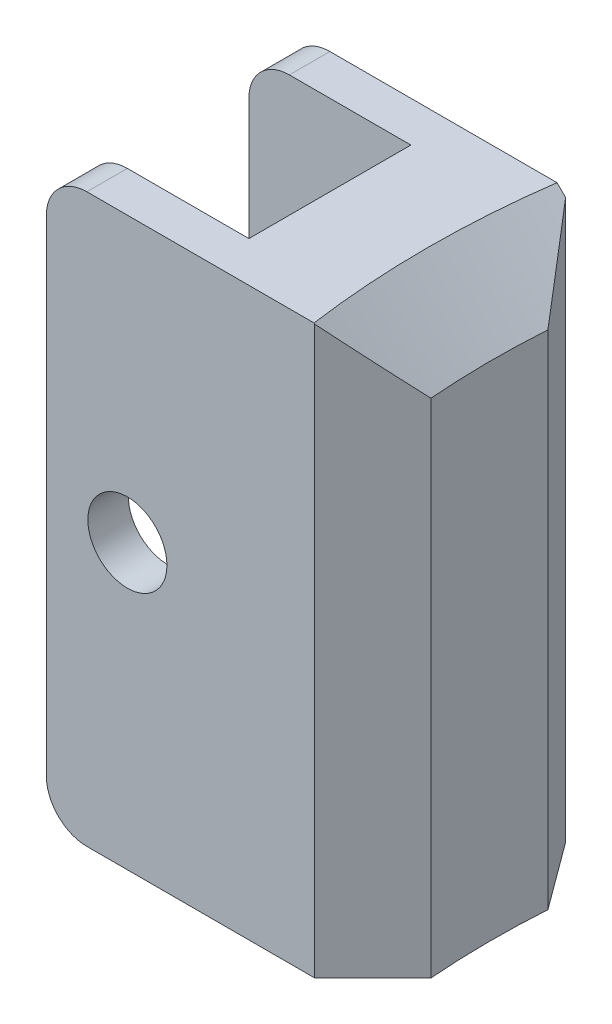
ISO-10303-21;
HEADER;
FILE_DESCRIPTION(('STEP AP214'),'2;1');
FILE_NAME('part.step','',(''),(''),'','','');
FILE_SCHEMA(('AUTOMOTIVE_DESIGN { 1 0 10303 214 1 1 1 1 }'));
ENDSEC;
DATA;
#1=APPLICATION_CONTEXT('core data for automotive mechanical design processes');
#2=APPLICATION_PROTOCOL_DEFINITION('international standard','automotive_design',2000,#1);
#3=PRODUCT_CONTEXT('',#1,'mechanical');
#4=PRODUCT('Part','Part','',(#3));
#5=PRODUCT_RELATED_PRODUCT_CATEGORY('part','',(#4));
#6=PRODUCT_DEFINITION_FORMATION('','',#4);
#7=PRODUCT_DEFINITION_CONTEXT('part definition',#1,'design');
#8=PRODUCT_DEFINITION('design','',#6,#7);
#9=PRODUCT_DEFINITION_SHAPE('','',#8);
#10=(LENGTH_UNIT() NAMED_UNIT(*) SI_UNIT(.MILLI.,.METRE.));
#11=(NAMED_UNIT(*) PLANE_ANGLE_UNIT() SI_UNIT($,.RADIAN.));
#12=(NAMED_UNIT(*) SI_UNIT($,.STERADIAN.) SOLID_ANGLE_UNIT());
#13=UNCERTAINTY_MEASURE_WITH_UNIT(LENGTH_MEASURE(1.E-05),#10,'distance_accuracy_value','');
#14=(GEOMETRIC_REPRESENTATION_CONTEXT(3) GLOBAL_UNCERTAINTY_ASSIGNED_CONTEXT((#13)) GLOBAL_UNIT_ASSIGNED_CONTEXT((#10,
#11,#12)) REPRESENTATION_CONTEXT('',''));
#15=CARTESIAN_POINT('',(0.,0.,0.));
#16=DIRECTION('',(0.,0.,1.));
#17=DIRECTION('',(1.,0.,0.));
#18=AXIS2_PLACEMENT_3D('',#15,#16,#17);
#19=CARTESIAN_POINT('',(-44.45,11.1125,4.7625));
#20=DIRECTION('',(1.,0.,0.));
#21=DIRECTION('',(0.,0.,-1.));
#22=AXIS2_PLACEMENT_3D('',#19,#20,#21);
#23=PLANE('',#22);
#24=DIRECTION('',(0.,-1.,0.));
#25=VECTOR('',#24,1.);
#26=CARTESIAN_POINT('',(-44.45,-11.1125,3.175));
#27=LINE('',#26,#25);
#28=CARTESIAN_POINT('',(-44.45,9.525,3.175));
#29=VERTEX_POINT('',#28);
#30=CARTESIAN_POINT('',(-44.45,-9.525,3.175));
#31=VERTEX_POINT('',#30);
#32=EDGE_CURVE('E154',#29,#31,#27,.T.);
#33=ORIENTED_EDGE('',*,*,#32,.T.);
#34=DIRECTION('',(0.,0.,-1.));
#35=VECTOR('',#34,1.);
#36=CARTESIAN_POINT('',(-44.45,-9.525,4.7625));
#37=LINE('',#36,#35);
#38=CARTESIAN_POINT('',(-44.45,-9.525,4.7625));
#39=VERTEX_POINT('',#38);
#40=EDGE_CURVE('E54',#31,#39,#37,.F.);
#41=ORIENTED_EDGE('',*,*,#40,.T.);
#42=DIRECTION('',(0.,-1.,0.));
#43=VECTOR('',#42,1.);
#44=CARTESIAN_POINT('',(-44.45,11.1125,4.7625));
#45=LINE('',#44,#43);
#46=CARTESIAN_POINT('',(-44.45,9.525,4.7625));
#47=VERTEX_POINT('',#46);
#48=EDGE_CURVE('E179',#47,#39,#45,.T.);
#49=ORIENTED_EDGE('',*,*,#48,.F.);
#50=DIRECTION('',(0.,0.,-1.));
#51=VECTOR('',#50,1.);
#52=CARTESIAN_POINT('',(-44.45,9.525,4.7625));
#53=LINE('',#52,#51);
#54=EDGE_CURVE('E247',#47,#29,#53,.T.);
#55=ORIENTED_EDGE('',*,*,#54,.T.);
#56=EDGE_LOOP('',(#33,#41,#49,#55));
#57=FACE_BOUND('',#56,.T.);
#58=ADVANCED_FACE('F32',(#57),#23,.F.);
#59=CARTESIAN_POINT('',(-28.575,11.1125,4.7625));
#60=DIRECTION('',(0.,-1.,0.));
#61=DIRECTION('',(1.,0.,0.));
#62=AXIS2_PLACEMENT_3D('',#59,#60,#61);
#63=PLANE('',#62);
#64=DIRECTION('',(-1.,0.,0.));
#65=VECTOR('',#64,1.);
#66=CARTESIAN_POINT('',(-28.575,11.1125,-4.7625));
#67=LINE('',#66,#65);
#68=CARTESIAN_POINT('',(-33.9576603103041,11.1125,-4.7625));
#69=VERTEX_POINT('',#68);
#70=CARTESIAN_POINT('',(-42.8625,11.1125,-4.7625));
#71=VERTEX_POINT('',#70);
#72=EDGE_CURVE('E172',#69,#71,#67,.T.);
#73=ORIENTED_EDGE('',*,*,#72,.T.);
#74=DIRECTION('',(0.,0.,-1.));
#75=VECTOR('',#74,1.);
#76=CARTESIAN_POINT('',(-42.8625,11.1125,4.7625));
#77=LINE('',#76,#75);
#78=CARTESIAN_POINT('',(-42.8625,11.1125,-3.175));
#79=VERTEX_POINT('',#78);
#80=EDGE_CURVE('E11',#71,#79,#77,.F.);
#81=ORIENTED_EDGE('',*,*,#80,.T.);
#82=DIRECTION('',(-1.,0.,0.));
#83=VECTOR('',#82,1.);
#84=CARTESIAN_POINT('',(-38.1,11.1125,-3.175));
#85=LINE('',#84,#83);
#86=CARTESIAN_POINT('',(-38.1,11.1125,-3.175));
#87=VERTEX_POINT('',#86);
#88=EDGE_CURVE('E163',#87,#79,#85,.T.);
#89=ORIENTED_EDGE('',*,*,#88,.F.);
#90=DIRECTION('',(0.,0.,1.));
#91=VECTOR('',#90,1.);
#92=CARTESIAN_POINT('',(-38.1,11.1125,-3.175));
#93=LINE('',#92,#91);
#94=CARTESIAN_POINT('',(-38.1,11.1125,3.175));
#95=VERTEX_POINT('',#94);
#96=EDGE_CURVE('E162',#87,#95,#93,.T.);
#97=ORIENTED_EDGE('',*,*,#96,.T.);
#98=DIRECTION('',(-1.,0.,0.));
#99=VECTOR('',#98,1.);
#100=CARTESIAN_POINT('',(-38.1,11.1125,3.175));
#101=LINE('',#100,#99);
#102=CARTESIAN_POINT('',(-42.8625,11.1125,3.175));
#103=VERTEX_POINT('',#102);
#104=EDGE_CURVE('E341',#95,#103,#101,.T.);
#105=ORIENTED_EDGE('',*,*,#104,.T.);
#106=DIRECTION('',(0.,0.,-1.));
#107=VECTOR('',#106,1.);
#108=CARTESIAN_POINT('',(-42.8625,11.1125,4.7625));
#109=LINE('',#108,#107);
#110=CARTESIAN_POINT('',(-42.8625,11.1125,4.7625));
#111=VERTEX_POINT('',#110);
#112=EDGE_CURVE('E40',#103,#111,#109,.F.);
#113=ORIENTED_EDGE('',*,*,#112,.T.);
#114=DIRECTION('',(-1.,0.,0.));
#115=VECTOR('',#114,1.);
#116=CARTESIAN_POINT('',(-28.575,11.1125,4.7625));
#117=LINE('',#116,#115);
#118=CARTESIAN_POINT('',(-33.9576603103041,11.1125,4.7625));
#119=VERTEX_POINT('',#118);
#120=EDGE_CURVE('E177',#119,#111,#117,.T.);
#121=ORIENTED_EDGE('',*,*,#120,.F.);
#122=CARTESIAN_POINT('',(0.,11.1125,0.));
#123=DIRECTION('',(0.,-1.,0.));
#124=DIRECTION('',(1.,0.,0.));
#125=AXIS2_PLACEMENT_3D('',#122,#123,#124);
#126=CIRCLE('',#125,34.29);
#127=EDGE_CURVE('E225',#119,#69,#126,.T.);
#128=ORIENTED_EDGE('',*,*,#127,.T.);
#129=EDGE_LOOP('',(#73,#81,#89,#97,#105,#113,#121,#128));
#130=FACE_BOUND('',#129,.T.);
#131=ADVANCED_FACE('F216',(#130),#63,.F.);
#132=DIRECTION('',(0.,-1.,0.));
#133=VECTOR('',#132,1.);
#134=CARTESIAN_POINT('',(-44.45,11.1125,-4.7625));
#135=LINE('',#134,#133);
#136=CARTESIAN_POINT('',(-44.45,9.525,-4.7625));
#137=VERTEX_POINT('',#136);
#138=CARTESIAN_POINT('',(-44.45,-9.525,-4.7625));
#139=VERTEX_POINT('',#138);
#140=EDGE_CURVE('E187',#137,#139,#135,.T.);
#141=ORIENTED_EDGE('',*,*,#140,.T.);
#142=DIRECTION('',(0.,0.,-1.));
#143=VECTOR('',#142,1.);
#144=CARTESIAN_POINT('',(-44.45,-9.525,4.7625));
#145=LINE('',#144,#143);
#146=CARTESIAN_POINT('',(-44.45,-9.525,-3.175));
#147=VERTEX_POINT('',#146);
#148=EDGE_CURVE('E237',#139,#147,#145,.F.);
#149=ORIENTED_EDGE('',*,*,#148,.T.);
#150=DIRECTION('',(0.,-1.,0.));
#151=VECTOR('',#150,1.);
#152=CARTESIAN_POINT('',(-44.45,-11.1125,-3.175));
#153=LINE('',#152,#151);
#154=CARTESIAN_POINT('',(-44.45,9.525,-3.175));
#155=VERTEX_POINT('',#154);
#156=EDGE_CURVE('E170',#155,#147,#153,.T.);
#157=ORIENTED_EDGE('',*,*,#156,.F.);
#158=DIRECTION('',(0.,0.,-1.));
#159=VECTOR('',#158,1.);
#160=CARTESIAN_POINT('',(-44.45,9.525,4.7625));
#161=LINE('',#160,#159);
#162=EDGE_CURVE('E235',#155,#137,#161,.T.);
#163=ORIENTED_EDGE('',*,*,#162,.T.);
#164=EDGE_LOOP('',(#141,#149,#157,#163));
#165=FACE_BOUND('',#164,.T.);
#166=ADVANCED_FACE('F214',(#165),#23,.F.);
#167=CARTESIAN_POINT('',(-44.45,-11.1125,4.7625));
#168=DIRECTION('',(0.,1.,0.));
#169=DIRECTION('',(-1.,0.,0.));
#170=AXIS2_PLACEMENT_3D('',#167,#168,#169);
#171=PLANE('',#170);
#172=DIRECTION('',(1.,0.,0.));
#173=VECTOR('',#172,1.);
#174=CARTESIAN_POINT('',(-38.1,-11.1125,-3.175));
#175=LINE('',#174,#173);
#176=CARTESIAN_POINT('',(-42.8625,-11.1125,-3.175));
#177=VERTEX_POINT('',#176);
#178=CARTESIAN_POINT('',(-38.1,-11.1125,-3.175));
#179=VERTEX_POINT('',#178);
#180=EDGE_CURVE('E141',#177,#179,#175,.T.);
#181=ORIENTED_EDGE('',*,*,#180,.F.);
#182=DIRECTION('',(0.,0.,-1.));
#183=VECTOR('',#182,1.);
#184=CARTESIAN_POINT('',(-42.8625,-11.1125,4.7625));
#185=LINE('',#184,#183);
#186=CARTESIAN_POINT('',(-42.8625,-11.1125,-4.7625));
#187=VERTEX_POINT('',#186);
#188=EDGE_CURVE('E266',#177,#187,#185,.T.);
#189=ORIENTED_EDGE('',*,*,#188,.T.);
#190=DIRECTION('',(1.,0.,0.));
#191=VECTOR('',#190,1.);
#192=CARTESIAN_POINT('',(-44.45,-11.1125,-4.7625));
#193=LINE('',#192,#191);
#194=CARTESIAN_POINT('',(-33.6214216836475,-11.1125,-4.7625));
#195=VERTEX_POINT('',#194);
#196=EDGE_CURVE('E180',#187,#195,#193,.T.);
#197=ORIENTED_EDGE('',*,*,#196,.T.);
#198=DIRECTION('',(0.593040555527492,0.,0.805172589883463));
#199=VECTOR('',#198,1.);
#200=CARTESIAN_POINT('',(-33.6214216836475,-11.1125,-4.7625));
#201=LINE('',#200,#199);
#202=CARTESIAN_POINT('',(-31.678807444753,-11.1125,-2.12500797134109));
#203=VERTEX_POINT('',#202);
#204=EDGE_CURVE('E284',#195,#203,#201,.T.);
#205=ORIENTED_EDGE('',*,*,#204,.T.);
#206=CARTESIAN_POINT('',(0.,-11.1125,0.));
#207=DIRECTION('',(0.,1.,0.));
#208=DIRECTION('',(-1.,0.,0.));
#209=AXIS2_PLACEMENT_3D('',#206,#207,#208);
#210=CIRCLE('',#209,31.75);
#211=CARTESIAN_POINT('',(-31.6526522796179,-11.1125,2.48437188552765));
#212=VERTEX_POINT('',#211);
#213=EDGE_CURVE('E346',#203,#212,#210,.T.);
#214=ORIENTED_EDGE('',*,*,#213,.T.);
#215=DIRECTION('',(-0.707106781186548,0.,0.707106781186548));
#216=VECTOR('',#215,1.);
#217=CARTESIAN_POINT('',(-31.6526522796179,-11.1125,2.48437188552765));
#218=LINE('',#217,#216);
#219=CARTESIAN_POINT('',(-33.9307803940902,-11.1125,4.7625));
#220=VERTEX_POINT('',#219);
#221=EDGE_CURVE('E263',#212,#220,#218,.T.);
#222=ORIENTED_EDGE('',*,*,#221,.T.);
#223=DIRECTION('',(1.,0.,0.));
#224=VECTOR('',#223,1.);
#225=CARTESIAN_POINT('',(-44.45,-11.1125,4.7625));
#226=LINE('',#225,#224);
#227=CARTESIAN_POINT('',(-42.8625,-11.1125,4.7625));
#228=VERTEX_POINT('',#227);
#229=EDGE_CURVE('E182',#228,#220,#226,.T.);
#230=ORIENTED_EDGE('',*,*,#229,.F.);
#231=DIRECTION('',(0.,0.,-1.));
#232=VECTOR('',#231,1.);
#233=CARTESIAN_POINT('',(-42.8625,-11.1125,4.7625));
#234=LINE('',#233,#232);
#235=CARTESIAN_POINT('',(-42.8625,-11.1125,3.175));
#236=VERTEX_POINT('',#235);
#237=EDGE_CURVE('E260',#228,#236,#234,.T.);
#238=ORIENTED_EDGE('',*,*,#237,.T.);
#239=DIRECTION('',(1.,0.,0.));
#240=VECTOR('',#239,1.);
#241=CARTESIAN_POINT('',(-38.1,-11.1125,3.175));
#242=LINE('',#241,#240);
#243=CARTESIAN_POINT('',(-38.1,-11.1125,3.175));
#244=VERTEX_POINT('',#243);
#245=EDGE_CURVE('E168',#236,#244,#242,.T.);
#246=ORIENTED_EDGE('',*,*,#245,.T.);
#247=DIRECTION('',(0.,0.,1.));
#248=VECTOR('',#247,1.);
#249=CARTESIAN_POINT('',(-38.1,-11.1125,-3.175));
#250=LINE('',#249,#248);
#251=EDGE_CURVE('E160',#179,#244,#250,.T.);
#252=ORIENTED_EDGE('',*,*,#251,.F.);
#253=EDGE_LOOP('',(#181,#189,#197,#205,#214,#222,#230,#238,#246,#252));
#254=FACE_BOUND('',#253,.T.);
#255=ADVANCED_FACE('F165',(#254),#171,.F.);
#256=CARTESIAN_POINT('',(0.,0.,4.7625));
#257=DIRECTION('',(0.,0.,1.));
#258=DIRECTION('',(1.,0.,0.));
#259=AXIS2_PLACEMENT_3D('',#256,#257,#258);
#260=PLANE('',#259);
#261=CARTESIAN_POINT('',(-41.275,0.,4.7625));
#262=DIRECTION('',(0.,0.,1.));
#263=DIRECTION('',(1.,0.,0.));
#264=AXIS2_PLACEMENT_3D('',#261,#262,#263);
#265=CIRCLE('',#264,1.55);
#266=CARTESIAN_POINT('',(-39.725,0.,4.7625));
#267=VERTEX_POINT('',#266);
#268=EDGE_CURVE('E352',#267,#267,#265,.T.);
#269=ORIENTED_EDGE('',*,*,#268,.F.);
#270=EDGE_LOOP('',(#269));
#271=FACE_BOUND('',#270,.T.);
#272=ORIENTED_EDGE('',*,*,#48,.T.);
#273=CARTESIAN_POINT('',(-42.8625,-9.525,4.7625));
#274=DIRECTION('',(0.,0.,1.));
#275=DIRECTION('',(1.,0.,0.));
#276=AXIS2_PLACEMENT_3D('',#273,#274,#275);
#277=CIRCLE('',#276,1.5875);
#278=EDGE_CURVE('E253',#39,#228,#277,.T.);
#279=ORIENTED_EDGE('',*,*,#278,.T.);
#280=ORIENTED_EDGE('',*,*,#229,.T.);
#281=DIRECTION('',(0.,1.,0.));
#282=VECTOR('',#281,1.);
#283=CARTESIAN_POINT('',(-33.9307803940902,11.1125,4.7625));
#284=LINE('',#283,#282);
#285=CARTESIAN_POINT('',(-33.9307803940902,11.0858808081161,4.7625));
#286=VERTEX_POINT('',#285);
#287=EDGE_CURVE('E269',#220,#286,#284,.T.);
#288=ORIENTED_EDGE('',*,*,#287,.T.);
#289=CARTESIAN_POINT('',(-33.9307803940902,11.0858808081161,4.7625));
#290=CARTESIAN_POINT('',(-33.9352603970809,11.0903173229757,4.7625));
#291=CARTESIAN_POINT('',(-33.939740391594,11.0947538463958,4.7625));
#292=CARTESIAN_POINT('',(-33.9487003636653,11.1036269103571,4.7625));
#293=CARTESIAN_POINT('',(-33.9531803412234,11.1080634508983,4.7625));
#294=CARTESIAN_POINT('',(-33.9576603103041,11.1125,4.7625));
#295=B_SPLINE_CURVE_WITH_KNOTS('',3,(#289,#290,#291,#292,#293,#294),.UNSPECIFIED.,.F.,.F.,(4,2,
4),(0.,0.0189150156768313,0.0378300313536604),.UNSPECIFIED.);
#296=EDGE_CURVE('E300',#286,#119,#295,.T.);
#297=ORIENTED_EDGE('',*,*,#296,.T.);
#298=ORIENTED_EDGE('',*,*,#120,.T.);
#299=CARTESIAN_POINT('',(-42.8625,9.525,4.7625));
#300=DIRECTION('',(0.,0.,1.));
#301=DIRECTION('',(1.,0.,0.));
#302=AXIS2_PLACEMENT_3D('',#299,#300,#301);
#303=CIRCLE('',#302,1.5875);
#304=EDGE_CURVE('E251',#111,#47,#303,.T.);
#305=ORIENTED_EDGE('',*,*,#304,.T.);
#306=EDGE_LOOP('',(#272,#279,#280,#288,#297,#298,#305));
#307=FACE_BOUND('',#306,.T.);
#308=ADVANCED_FACE('F208',(#271,#307),#260,.T.);
#309=CARTESIAN_POINT('',(0.,0.,-4.7625));
#310=DIRECTION('',(0.,0.,1.));
#311=DIRECTION('',(1.,0.,0.));
#312=AXIS2_PLACEMENT_3D('',#309,#310,#311);
#313=PLANE('',#312);
#314=CARTESIAN_POINT('',(-41.275,0.,-4.7625));
#315=DIRECTION('',(0.,0.,1.));
#316=DIRECTION('',(1.,0.,0.));
#317=AXIS2_PLACEMENT_3D('',#314,#315,#316);
#318=CIRCLE('',#317,1.55);
#319=CARTESIAN_POINT('',(-39.725,0.,-4.7625));
#320=VERTEX_POINT('',#319);
#321=EDGE_CURVE('E355',#320,#320,#318,.T.);
#322=ORIENTED_EDGE('',*,*,#321,.T.);
#323=EDGE_LOOP('',(#322));
#324=FACE_BOUND('',#323,.T.);
#325=ORIENTED_EDGE('',*,*,#196,.F.);
#326=CARTESIAN_POINT('',(-42.8625,-9.525,-4.7625));
#327=DIRECTION('',(0.,0.,1.));
#328=DIRECTION('',(1.,0.,0.));
#329=AXIS2_PLACEMENT_3D('',#326,#327,#328);
#330=CIRCLE('',#329,1.5875);
#331=EDGE_CURVE('E276',#187,#139,#330,.F.);
#332=ORIENTED_EDGE('',*,*,#331,.T.);
#333=ORIENTED_EDGE('',*,*,#140,.F.);
#334=CARTESIAN_POINT('',(-42.8625,9.525,-4.7625));
#335=DIRECTION('',(0.,0.,1.));
#336=DIRECTION('',(1.,0.,0.));
#337=AXIS2_PLACEMENT_3D('',#334,#335,#336);
#338=CIRCLE('',#337,1.5875);
#339=EDGE_CURVE('E232',#137,#71,#338,.F.);
#340=ORIENTED_EDGE('',*,*,#339,.T.);
#341=ORIENTED_EDGE('',*,*,#72,.F.);
#342=CARTESIAN_POINT('',(-33.9576603103041,11.1125,-4.7625));
#343=CARTESIAN_POINT('',(-33.9016232281389,11.0570060045181,-4.7625));
#344=CARTESIAN_POINT('',(-33.8455848015017,11.0015133667974,-4.7625));
#345=CARTESIAN_POINT('',(-33.7335052592828,10.8905308068781,-4.7625));
#346=CARTESIAN_POINT('',(-33.6774641437012,10.8350408846794,-4.7625));
#347=CARTESIAN_POINT('',(-33.6214216836475,10.7795523202419,-4.7625));
#348=B_SPLINE_CURVE_WITH_KNOTS('',3,(#342,#343,#344,#345,#346,#347),.UNSPECIFIED.,.F.,.F.,(4,2,
4),(0.,0.236595948635203,0.473191897271758),.UNSPECIFIED.);
#349=CARTESIAN_POINT('',(-33.6214216836475,10.7795523202419,-4.7625));
#350=VERTEX_POINT('',#349);
#351=EDGE_CURVE('E184',#69,#350,#348,.T.);
#352=ORIENTED_EDGE('',*,*,#351,.T.);
#353=DIRECTION('',(0.,-1.,0.));
#354=VECTOR('',#353,1.);
#355=CARTESIAN_POINT('',(-33.6214216836475,0.,-4.7625));
#356=LINE('',#355,#354);
#357=EDGE_CURVE('E197',#350,#195,#356,.T.);
#358=ORIENTED_EDGE('',*,*,#357,.T.);
#359=EDGE_LOOP('',(#325,#332,#333,#340,#341,#352,#358));
#360=FACE_BOUND('',#359,.T.);
#361=ADVANCED_FACE('F203',(#324,#360),#313,.F.);
#362=CARTESIAN_POINT('',(-38.1,11.1125,-3.175));
#363=DIRECTION('',(1.,0.,0.));
#364=DIRECTION('',(0.,0.,-1.));
#365=AXIS2_PLACEMENT_3D('',#362,#363,#364);
#366=PLANE('',#365);
#367=DIRECTION('',(0.,1.,0.));
#368=VECTOR('',#367,1.);
#369=CARTESIAN_POINT('',(-38.1,11.1125,3.175));
#370=LINE('',#369,#368);
#371=EDGE_CURVE('E342',#244,#95,#370,.T.);
#372=ORIENTED_EDGE('',*,*,#371,.T.);
#373=ORIENTED_EDGE('',*,*,#96,.F.);
#374=DIRECTION('',(0.,1.,0.));
#375=VECTOR('',#374,1.);
#376=CARTESIAN_POINT('',(-38.1,11.1125,-3.175));
#377=LINE('',#376,#375);
#378=EDGE_CURVE('E146',#179,#87,#377,.T.);
#379=ORIENTED_EDGE('',*,*,#378,.F.);
#380=ORIENTED_EDGE('',*,*,#251,.T.);
#381=EDGE_LOOP('',(#372,#373,#379,#380));
#382=FACE_BOUND('',#381,.T.);
#383=ADVANCED_FACE('F159',(#382),#366,.F.);
#384=CARTESIAN_POINT('',(0.,0.,-3.175));
#385=DIRECTION('',(0.,0.,-1.));
#386=DIRECTION('',(-1.,0.,0.));
#387=AXIS2_PLACEMENT_3D('',#384,#385,#386);
#388=PLANE('',#387);
#389=CARTESIAN_POINT('',(-41.275,0.,-3.175));
#390=DIRECTION('',(0.,0.,-1.));
#391=DIRECTION('',(-1.,0.,0.));
#392=AXIS2_PLACEMENT_3D('',#389,#390,#391);
#393=CIRCLE('',#392,1.55);
#394=CARTESIAN_POINT('',(-39.725,0.,-3.175));
#395=VERTEX_POINT('',#394);
#396=EDGE_CURVE('E311',#395,#395,#393,.T.);
#397=ORIENTED_EDGE('',*,*,#396,.T.);
#398=EDGE_LOOP('',(#397));
#399=FACE_BOUND('',#398,.T.);
#400=ORIENTED_EDGE('',*,*,#156,.T.);
#401=CARTESIAN_POINT('',(-42.8625,-9.525,-3.175));
#402=DIRECTION('',(0.,0.,-1.));
#403=DIRECTION('',(-1.,0.,0.));
#404=AXIS2_PLACEMENT_3D('',#401,#402,#403);
#405=CIRCLE('',#404,1.5875);
#406=EDGE_CURVE('E149',#147,#177,#405,.F.);
#407=ORIENTED_EDGE('',*,*,#406,.T.);
#408=ORIENTED_EDGE('',*,*,#180,.T.);
#409=ORIENTED_EDGE('',*,*,#378,.T.);
#410=ORIENTED_EDGE('',*,*,#88,.T.);
#411=CARTESIAN_POINT('',(-42.8625,9.525,-3.175));
#412=DIRECTION('',(0.,0.,-1.));
#413=DIRECTION('',(-1.,0.,0.));
#414=AXIS2_PLACEMENT_3D('',#411,#412,#413);
#415=CIRCLE('',#414,1.5875);
#416=EDGE_CURVE('E234',#79,#155,#415,.F.);
#417=ORIENTED_EDGE('',*,*,#416,.T.);
#418=EDGE_LOOP('',(#400,#407,#408,#409,#410,#417));
#419=FACE_BOUND('',#418,.T.);
#420=ADVANCED_FACE('F144',(#399,#419),#388,.F.);
#421=CARTESIAN_POINT('',(0.,0.,3.175));
#422=DIRECTION('',(0.,0.,-1.));
#423=DIRECTION('',(-1.,0.,0.));
#424=AXIS2_PLACEMENT_3D('',#421,#422,#423);
#425=PLANE('',#424);
#426=CARTESIAN_POINT('',(-41.275,0.,3.175));
#427=DIRECTION('',(0.,0.,-1.));
#428=DIRECTION('',(-1.,0.,0.));
#429=AXIS2_PLACEMENT_3D('',#426,#427,#428);
#430=CIRCLE('',#429,1.55);
#431=CARTESIAN_POINT('',(-39.725,0.,3.175));
#432=VERTEX_POINT('',#431);
#433=EDGE_CURVE('E272',#432,#432,#430,.T.);
#434=ORIENTED_EDGE('',*,*,#433,.F.);
#435=EDGE_LOOP('',(#434));
#436=FACE_BOUND('',#435,.T.);
#437=ORIENTED_EDGE('',*,*,#245,.F.);
#438=CARTESIAN_POINT('',(-42.8625,-9.525,3.175));
#439=DIRECTION('',(0.,0.,-1.));
#440=DIRECTION('',(-1.,0.,0.));
#441=AXIS2_PLACEMENT_3D('',#438,#439,#440);
#442=CIRCLE('',#441,1.5875);
#443=EDGE_CURVE('E245',#236,#31,#442,.T.);
#444=ORIENTED_EDGE('',*,*,#443,.T.);
#445=ORIENTED_EDGE('',*,*,#32,.F.);
#446=CARTESIAN_POINT('',(-42.8625,9.525,3.175));
#447=DIRECTION('',(0.,0.,-1.));
#448=DIRECTION('',(-1.,0.,0.));
#449=AXIS2_PLACEMENT_3D('',#446,#447,#448);
#450=CIRCLE('',#449,1.5875);
#451=EDGE_CURVE('E239',#29,#103,#450,.T.);
#452=ORIENTED_EDGE('',*,*,#451,.T.);
#453=ORIENTED_EDGE('',*,*,#104,.F.);
#454=ORIENTED_EDGE('',*,*,#371,.F.);
#455=EDGE_LOOP('',(#437,#444,#445,#452,#453,#454));
#456=FACE_BOUND('',#455,.T.);
#457=ADVANCED_FACE('F340',(#436,#456),#425,.T.);
#458=CARTESIAN_POINT('',(0.,-11.1125,0.));
#459=DIRECTION('',(0.,1.,0.));
#460=DIRECTION('',(-1.,0.,0.));
#461=AXIS2_PLACEMENT_3D('',#458,#459,#460);
#462=CYLINDRICAL_SURFACE('',#461,31.75);
#463=ORIENTED_EDGE('',*,*,#213,.F.);
#464=DIRECTION('',(0.,1.,0.));
#465=VECTOR('',#464,1.);
#466=CARTESIAN_POINT('',(-31.678807444753,-11.1125,-2.12500797134109));
#467=LINE('',#466,#465);
#468=CARTESIAN_POINT('',(-31.678807444753,8.57250000000001,-2.12500797134109));
#469=VERTEX_POINT('',#468);
#470=EDGE_CURVE('E291',#203,#469,#467,.T.);
#471=ORIENTED_EDGE('',*,*,#470,.T.);
#472=CARTESIAN_POINT('',(0.,8.57250000000001,0.));
#473=DIRECTION('',(0.,-1.,0.));
#474=DIRECTION('',(1.,0.,0.));
#475=AXIS2_PLACEMENT_3D('',#472,#473,#474);
#476=CIRCLE('',#475,31.75);
#477=CARTESIAN_POINT('',(-31.6526522796179,8.57250000000001,2.48437188552765));
#478=VERTEX_POINT('',#477);
#479=EDGE_CURVE('E292',#469,#478,#476,.F.);
#480=ORIENTED_EDGE('',*,*,#479,.T.);
#481=DIRECTION('',(0.,1.,0.));
#482=VECTOR('',#481,1.);
#483=CARTESIAN_POINT('',(-31.6526522796179,-11.1125,2.48437188552765));
#484=LINE('',#483,#482);
#485=EDGE_CURVE('E297',#478,#212,#484,.F.);
#486=ORIENTED_EDGE('',*,*,#485,.T.);
#487=EDGE_LOOP('',(#463,#471,#480,#486));
#488=FACE_BOUND('',#487,.T.);
#489=ADVANCED_FACE('F323',(#488),#462,.F.);
#490=CARTESIAN_POINT('',(-31.6526522796179,-11.1125,2.48437188552765));
#491=DIRECTION('',(0.707106781186548,0.,0.707106781186548));
#492=DIRECTION('',(0.,1.,0.));
#493=AXIS2_PLACEMENT_3D('',#490,#491,#492);
#494=PLANE('',#493);
#495=ORIENTED_EDGE('',*,*,#221,.F.);
#496=ORIENTED_EDGE('',*,*,#485,.F.);
#497=CARTESIAN_POINT('',(-33.9307803940902,11.0858808081161,4.7625));
#498=CARTESIAN_POINT('',(-33.7426197611455,10.8733954006392,4.5743393670553));
#499=CARTESIAN_POINT('',(-33.5540731150106,10.6615924600558,4.38579272092035));
#500=CARTESIAN_POINT('',(-33.1761618915087,10.2394706932847,4.00788149741842));
#501=CARTESIAN_POINT('',(-32.9867973432342,10.0291518149989,3.81851694914397));
#502=CARTESIAN_POINT('',(-32.6071903935126,9.61010151907732,3.43890999942233));
#503=CARTESIAN_POINT('',(-32.4169479886119,9.40137010769528,3.24866759452163));
#504=CARTESIAN_POINT('',(-32.0355203604371,8.98561782557998,2.86723996634688));
#505=CARTESIAN_POINT('',(-31.844335104129,8.77859701546964,2.67605471003877));
#506=CARTESIAN_POINT('',(-31.6526522796179,8.57249999999998,2.48437188552768));
#507=B_SPLINE_CURVE_WITH_KNOTS('',3,(#497,#498,#499,#500,#501,#502,#503,#504,#505,#506),
.UNSPECIFIED.,.F.,.F.,(4,2,2,2,4),(0.,1.02158207285164,2.04312810275649,3.06467815488652,
4.08626425633454),.UNSPECIFIED.);
#508=EDGE_CURVE('E310',#286,#478,#507,.T.);
#509=ORIENTED_EDGE('',*,*,#508,.F.);
#510=ORIENTED_EDGE('',*,*,#287,.F.);
#511=EDGE_LOOP('',(#495,#496,#509,#510));
#512=FACE_BOUND('',#511,.T.);
#513=ADVANCED_FACE('F319',(#512),#494,.T.);
#514=CARTESIAN_POINT('',(0.,8.57250000000001,0.));
#515=DIRECTION('',(0.,1.,0.));
#516=DIRECTION('',(-1.,0.,0.));
#517=AXIS2_PLACEMENT_3D('',#514,#515,#516);
#518=CONICAL_SURFACE('',#517,31.75,0.785398163397451);
#519=ORIENTED_EDGE('',*,*,#508,.T.);
#520=ORIENTED_EDGE('',*,*,#479,.F.);
#521=CARTESIAN_POINT('',(-31.678807444753,8.57250000000001,-2.12500797134109));
#522=CARTESIAN_POINT('',(-31.8428186118604,8.75105107540496,-2.34768632775171));
#523=CARTESIAN_POINT('',(-32.0062611981724,8.93108265096127,-2.56959272064761));
#524=CARTESIAN_POINT('',(-32.3320537541385,9.29388388717091,-3.01192205817263));
#525=CARTESIAN_POINT('',(-32.4944038183681,9.47665330628302,-3.23234513120722));
#526=CARTESIAN_POINT('',(-32.8180831801691,9.84473706510092,-3.6718053799272));
#527=CARTESIAN_POINT('',(-32.9794124868414,10.03005138207,-3.89084256796889));
#528=CARTESIAN_POINT('',(-33.3011202682093,10.4030631877581,-4.32762599718857));
#529=CARTESIAN_POINT('',(-33.4614986582718,10.5907608840663,-4.54537212346004));
#530=CARTESIAN_POINT('',(-33.6214216836475,10.7795523202419,-4.7625));
#531=B_SPLINE_CURVE_WITH_KNOTS('',3,(#521,#522,#523,#524,#525,#526,#527,#528,#529,#530),
.UNSPECIFIED.,.F.,.F.,(4,2,2,2,4),(0.,0.987560572830621,1.97503452715913,2.96249966490268,
3.9500514076395),.UNSPECIFIED.);
#532=EDGE_CURVE('E306',#350,#469,#531,.F.);
#533=ORIENTED_EDGE('',*,*,#532,.F.);
#534=ORIENTED_EDGE('',*,*,#351,.F.);
#535=ORIENTED_EDGE('',*,*,#127,.F.);
#536=ORIENTED_EDGE('',*,*,#296,.F.);
#537=EDGE_LOOP('',(#519,#520,#533,#534,#535,#536));
#538=FACE_BOUND('',#537,.T.);
#539=ADVANCED_FACE('F199',(#538),#518,.F.);
#540=CARTESIAN_POINT('',(-33.6214216836475,-11.1125,-4.7625));
#541=DIRECTION('',(0.805172589883463,0.,-0.593040555527492));
#542=DIRECTION('',(0.,1.,0.));
#543=AXIS2_PLACEMENT_3D('',#540,#541,#542);
#544=PLANE('',#543);
#545=ORIENTED_EDGE('',*,*,#532,.T.);
#546=ORIENTED_EDGE('',*,*,#470,.F.);
#547=ORIENTED_EDGE('',*,*,#204,.F.);
#548=ORIENTED_EDGE('',*,*,#357,.F.);
#549=EDGE_LOOP('',(#545,#546,#547,#548));
#550=FACE_BOUND('',#549,.T.);
#551=ADVANCED_FACE('F290',(#550),#544,.T.);
#552=CARTESIAN_POINT('',(-41.275,0.,-4.7625));
#553=DIRECTION('',(0.,0.,1.));
#554=DIRECTION('',(1.,0.,0.));
#555=AXIS2_PLACEMENT_3D('',#552,#553,#554);
#556=CYLINDRICAL_SURFACE('',#555,1.55);
#557=CARTESIAN_POINT('',(-39.725,0.,3.175));
#558=CARTESIAN_POINT('',(-39.725,0.,3.19153645833334));
#559=CARTESIAN_POINT('',(-39.725,0.,3.20807291666667));
#560=CARTESIAN_POINT('',(-39.725,0.,3.24114583333334));
#561=CARTESIAN_POINT('',(-39.725,0.,3.25768229166667));
#562=CARTESIAN_POINT('',(-39.725,0.,3.29075520833333));
#563=CARTESIAN_POINT('',(-39.725,0.,3.30729166666667));
#564=CARTESIAN_POINT('',(-39.725,0.,3.34036458333333));
#565=CARTESIAN_POINT('',(-39.725,0.,3.35690104166667));
#566=CARTESIAN_POINT('',(-39.725,0.,3.38997395833333));
#567=CARTESIAN_POINT('',(-39.725,0.,3.40651041666667));
#568=CARTESIAN_POINT('',(-39.725,0.,3.43958333333333));
#569=CARTESIAN_POINT('',(-39.725,0.,3.45611979166667));
#570=CARTESIAN_POINT('',(-39.725,0.,3.48919270833333));
#571=CARTESIAN_POINT('',(-39.725,0.,3.50572916666667));
#572=CARTESIAN_POINT('',(-39.725,0.,3.53880208333333));
#573=CARTESIAN_POINT('',(-39.725,0.,3.55533854166667));
#574=CARTESIAN_POINT('',(-39.725,0.,3.58841145833334));
#575=CARTESIAN_POINT('',(-39.725,0.,3.60494791666667));
#576=CARTESIAN_POINT('',(-39.725,0.,3.63802083333333));
#577=CARTESIAN_POINT('',(-39.725,0.,3.65455729166667));
#578=CARTESIAN_POINT('',(-39.725,0.,3.68763020833333));
#579=CARTESIAN_POINT('',(-39.725,0.,3.70416666666667));
#580=CARTESIAN_POINT('',(-39.725,0.,3.73723958333334));
#581=CARTESIAN_POINT('',(-39.725,0.,3.75377604166667));
#582=CARTESIAN_POINT('',(-39.725,0.,3.78684895833333));
#583=CARTESIAN_POINT('',(-39.725,0.,3.80338541666667));
#584=CARTESIAN_POINT('',(-39.725,0.,3.83645833333333));
#585=CARTESIAN_POINT('',(-39.725,0.,3.85299479166667));
#586=CARTESIAN_POINT('',(-39.725,0.,3.88606770833333));
#587=CARTESIAN_POINT('',(-39.725,0.,3.90260416666667));
#588=CARTESIAN_POINT('',(-39.725,0.,3.93567708333333));
#589=CARTESIAN_POINT('',(-39.725,0.,3.95221354166667));
#590=CARTESIAN_POINT('',(-39.725,0.,3.98528645833333));
#591=CARTESIAN_POINT('',(-39.725,0.,4.00182291666667));
#592=CARTESIAN_POINT('',(-39.725,0.,4.03489583333333));
#593=CARTESIAN_POINT('',(-39.725,0.,4.05143229166667));
#594=CARTESIAN_POINT('',(-39.725,0.,4.08450520833333));
#595=CARTESIAN_POINT('',(-39.725,0.,4.10104166666667));
#596=CARTESIAN_POINT('',(-39.725,0.,4.13411458333333));
#597=CARTESIAN_POINT('',(-39.725,0.,4.15065104166667));
#598=CARTESIAN_POINT('',(-39.725,0.,4.18372395833333));
#599=CARTESIAN_POINT('',(-39.725,0.,4.20026041666667));
#600=CARTESIAN_POINT('',(-39.725,0.,4.23333333333333));
#601=CARTESIAN_POINT('',(-39.725,0.,4.24986979166667));
#602=CARTESIAN_POINT('',(-39.725,0.,4.28294270833333));
#603=CARTESIAN_POINT('',(-39.725,0.,4.29947916666667));
#604=CARTESIAN_POINT('',(-39.725,0.,4.33255208333333));
#605=CARTESIAN_POINT('',(-39.725,0.,4.34908854166667));
#606=CARTESIAN_POINT('',(-39.725,0.,4.38216145833333));
#607=CARTESIAN_POINT('',(-39.725,0.,4.39869791666667));
#608=CARTESIAN_POINT('',(-39.725,0.,4.43177083333333));
#609=CARTESIAN_POINT('',(-39.725,0.,4.44830729166667));
#610=CARTESIAN_POINT('',(-39.725,0.,4.48138020833333));
#611=CARTESIAN_POINT('',(-39.725,0.,4.49791666666667));
#612=CARTESIAN_POINT('',(-39.725,0.,4.53098958333333));
#613=CARTESIAN_POINT('',(-39.725,0.,4.54752604166667));
#614=CARTESIAN_POINT('',(-39.725,0.,4.58059895833333));
#615=CARTESIAN_POINT('',(-39.725,0.,4.59713541666667));
#616=CARTESIAN_POINT('',(-39.725,0.,4.63020833333333));
#617=CARTESIAN_POINT('',(-39.725,0.,4.64674479166667));
#618=CARTESIAN_POINT('',(-39.725,0.,4.67981770833333));
#619=CARTESIAN_POINT('',(-39.725,0.,4.69635416666667));
#620=CARTESIAN_POINT('',(-39.725,0.,4.72942708333333));
#621=CARTESIAN_POINT('',(-39.725,0.,4.74596354166667));
#622=CARTESIAN_POINT('',(-39.725,0.,4.7625));
#623=B_SPLINE_CURVE_WITH_KNOTS('',3,(#557,#558,#559,#560,#561,#562,#563,#564,#565,#566,#567,
#568,#569,#570,#571,#572,#573,#574,#575,#576,#577,#578,#579,#580,#581,#582,#583,#584,#585,#586,
#587,#588,#589,#590,#591,#592,#593,#594,#595,#596,#597,#598,#599,#600,#601,#602,#603,#604,#605,
#606,#607,#608,#609,#610,#611,#612,#613,#614,#615,#616,#617,#618,#619,#620,#621,#622),
.UNSPECIFIED.,.F.,.F.,(4,2,2,2,2,2,2,2,2,2,2,2,2,2,2,2,2,2,2,2,2,2,2,2,2,2,2,2,2,2,2,2,4),(0.,
0.0496093750000006,0.0992187499999995,0.148828125,0.198437499999999,0.248046875,0.29765625,
0.347265624999999,0.396875,0.446484375,0.496093749999999,0.545703125,0.5953125,
0.644921874999999,0.69453125,0.744140624999999,0.793749999999999,0.843359375,0.892968749999999,
0.942578124999999,0.992187499999998,1.041796875,1.09140625,1.141015625,1.190625,1.240234375,
1.28984375,1.339453125,1.3890625,1.438671875,1.48828125,1.537890625,1.5875),.UNSPECIFIED.);
#624=EDGE_CURVE('BSEAM318',#432,#267,#623,.T.);
#625=ORIENTED_EDGE('',*,*,#433,.T.);
#626=ORIENTED_EDGE('',*,*,#268,.T.);
#627=ORIENTED_EDGE('',*,*,#624,.T.);
#628=ORIENTED_EDGE('',*,*,#624,.F.);
#629=EDGE_LOOP('',(#625,#627,#626,#628));
#630=FACE_BOUND('',#629,.T.);
#631=ADVANCED_FACE('F318',(#630),#556,.F.);
#632=CARTESIAN_POINT('',(-39.725,0.,-4.7625));
#633=CARTESIAN_POINT('',(-39.725,0.,-4.74596354166667));
#634=CARTESIAN_POINT('',(-39.725,0.,-4.72942708333333));
#635=CARTESIAN_POINT('',(-39.725,0.,-4.69635416666667));
#636=CARTESIAN_POINT('',(-39.725,0.,-4.67981770833333));
#637=CARTESIAN_POINT('',(-39.725,0.,-4.64674479166667));
#638=CARTESIAN_POINT('',(-39.725,0.,-4.63020833333333));
#639=CARTESIAN_POINT('',(-39.725,0.,-4.59713541666667));
#640=CARTESIAN_POINT('',(-39.725,0.,-4.58059895833333));
#641=CARTESIAN_POINT('',(-39.725,0.,-4.54752604166667));
#642=CARTESIAN_POINT('',(-39.725,0.,-4.53098958333333));
#643=CARTESIAN_POINT('',(-39.725,0.,-4.49791666666667));
#644=CARTESIAN_POINT('',(-39.725,0.,-4.48138020833333));
#645=CARTESIAN_POINT('',(-39.725,0.,-4.44830729166667));
#646=CARTESIAN_POINT('',(-39.725,0.,-4.43177083333333));
#647=CARTESIAN_POINT('',(-39.725,0.,-4.39869791666667));
#648=CARTESIAN_POINT('',(-39.725,0.,-4.38216145833333));
#649=CARTESIAN_POINT('',(-39.725,0.,-4.34908854166667));
#650=CARTESIAN_POINT('',(-39.725,0.,-4.33255208333333));
#651=CARTESIAN_POINT('',(-39.725,0.,-4.29947916666667));
#652=CARTESIAN_POINT('',(-39.725,0.,-4.28294270833333));
#653=CARTESIAN_POINT('',(-39.725,0.,-4.24986979166667));
#654=CARTESIAN_POINT('',(-39.725,0.,-4.23333333333333));
#655=CARTESIAN_POINT('',(-39.725,0.,-4.20026041666667));
#656=CARTESIAN_POINT('',(-39.725,0.,-4.18372395833333));
#657=CARTESIAN_POINT('',(-39.725,0.,-4.15065104166667));
#658=CARTESIAN_POINT('',(-39.725,0.,-4.13411458333333));
#659=CARTESIAN_POINT('',(-39.725,0.,-4.10104166666667));
#660=CARTESIAN_POINT('',(-39.725,0.,-4.08450520833333));
#661=CARTESIAN_POINT('',(-39.725,0.,-4.05143229166667));
#662=CARTESIAN_POINT('',(-39.725,0.,-4.03489583333333));
#663=CARTESIAN_POINT('',(-39.725,0.,-4.00182291666667));
#664=CARTESIAN_POINT('',(-39.725,0.,-3.98528645833333));
#665=CARTESIAN_POINT('',(-39.725,0.,-3.95221354166667));
#666=CARTESIAN_POINT('',(-39.725,0.,-3.93567708333333));
#667=CARTESIAN_POINT('',(-39.725,0.,-3.90260416666667));
#668=CARTESIAN_POINT('',(-39.725,0.,-3.88606770833333));
#669=CARTESIAN_POINT('',(-39.725,0.,-3.85299479166667));
#670=CARTESIAN_POINT('',(-39.725,0.,-3.83645833333333));
#671=CARTESIAN_POINT('',(-39.725,0.,-3.80338541666667));
#672=CARTESIAN_POINT('',(-39.725,0.,-3.78684895833333));
#673=CARTESIAN_POINT('',(-39.725,0.,-3.75377604166667));
#674=CARTESIAN_POINT('',(-39.725,0.,-3.73723958333333));
#675=CARTESIAN_POINT('',(-39.725,0.,-3.70416666666667));
#676=CARTESIAN_POINT('',(-39.725,0.,-3.68763020833333));
#677=CARTESIAN_POINT('',(-39.725,0.,-3.65455729166667));
#678=CARTESIAN_POINT('',(-39.725,0.,-3.63802083333333));
#679=CARTESIAN_POINT('',(-39.725,0.,-3.60494791666667));
#680=CARTESIAN_POINT('',(-39.725,0.,-3.58841145833333));
#681=CARTESIAN_POINT('',(-39.725,0.,-3.55533854166667));
#682=CARTESIAN_POINT('',(-39.725,0.,-3.53880208333333));
#683=CARTESIAN_POINT('',(-39.725,0.,-3.50572916666667));
#684=CARTESIAN_POINT('',(-39.725,0.,-3.48919270833333));
#685=CARTESIAN_POINT('',(-39.725,0.,-3.45611979166667));
#686=CARTESIAN_POINT('',(-39.725,0.,-3.43958333333333));
#687=CARTESIAN_POINT('',(-39.725,0.,-3.40651041666667));
#688=CARTESIAN_POINT('',(-39.725,0.,-3.38997395833333));
#689=CARTESIAN_POINT('',(-39.725,0.,-3.35690104166667));
#690=CARTESIAN_POINT('',(-39.725,0.,-3.34036458333333));
#691=CARTESIAN_POINT('',(-39.725,0.,-3.30729166666667));
#692=CARTESIAN_POINT('',(-39.725,0.,-3.29075520833333));
#693=CARTESIAN_POINT('',(-39.725,0.,-3.25768229166667));
#694=CARTESIAN_POINT('',(-39.725,0.,-3.24114583333333));
#695=CARTESIAN_POINT('',(-39.725,0.,-3.20807291666667));
#696=CARTESIAN_POINT('',(-39.725,0.,-3.19153645833333));
#697=CARTESIAN_POINT('',(-39.725,0.,-3.175));
#698=B_SPLINE_CURVE_WITH_KNOTS('',3,(#632,#633,#634,#635,#636,#637,#638,#639,#640,#641,#642,
#643,#644,#645,#646,#647,#648,#649,#650,#651,#652,#653,#654,#655,#656,#657,#658,#659,#660,#661,
#662,#663,#664,#665,#666,#667,#668,#669,#670,#671,#672,#673,#674,#675,#676,#677,#678,#679,#680,
#681,#682,#683,#684,#685,#686,#687,#688,#689,#690,#691,#692,#693,#694,#695,#696,#697),
.UNSPECIFIED.,.F.,.F.,(4,2,2,2,2,2,2,2,2,2,2,2,2,2,2,2,2,2,2,2,2,2,2,2,2,2,2,2,2,2,2,2,4),(0.,
0.0496093749999997,0.0992187499999995,0.148828124999999,0.1984375,0.248046875,0.297656249999999,
0.347265625,0.396875,0.446484375,0.49609375,0.545703125,0.595312499999999,0.644921875,
0.69453125,0.744140625,0.79375,0.843359375,0.89296875,0.942578125,0.9921875,1.041796875,
1.09140625,1.141015625,1.190625,1.240234375,1.28984375,1.339453125,1.3890625,1.438671875,
1.48828125,1.537890625,1.5875),.UNSPECIFIED.);
#699=EDGE_CURVE('BSEAM327',#320,#395,#698,.T.);
#700=ORIENTED_EDGE('',*,*,#321,.F.);
#701=ORIENTED_EDGE('',*,*,#396,.F.);
#702=ORIENTED_EDGE('',*,*,#699,.T.);
#703=ORIENTED_EDGE('',*,*,#699,.F.);
#704=EDGE_LOOP('',(#700,#702,#701,#703));
#705=FACE_BOUND('',#704,.T.);
#706=ADVANCED_FACE('F327',(#705),#556,.F.);
#707=CARTESIAN_POINT('',(-42.8625,-9.525,4.7625));
#708=DIRECTION('',(0.,0.,-1.));
#709=DIRECTION('',(-1.,0.,0.));
#710=AXIS2_PLACEMENT_3D('',#707,#708,#709);
#711=CYLINDRICAL_SURFACE('',#710,1.5875);
#712=ORIENTED_EDGE('',*,*,#406,.F.);
#713=ORIENTED_EDGE('',*,*,#148,.F.);
#714=ORIENTED_EDGE('',*,*,#331,.F.);
#715=ORIENTED_EDGE('',*,*,#188,.F.);
#716=EDGE_LOOP('',(#712,#713,#714,#715));
#717=FACE_BOUND('',#716,.T.);
#718=ADVANCED_FACE('F282',(#717),#711,.T.);
#719=CARTESIAN_POINT('',(-42.8625,-9.525,4.7625));
#720=DIRECTION('',(0.,0.,-1.));
#721=DIRECTION('',(-1.,0.,0.));
#722=AXIS2_PLACEMENT_3D('',#719,#720,#721);
#723=CYLINDRICAL_SURFACE('',#722,1.5875);
#724=ORIENTED_EDGE('',*,*,#278,.F.);
#725=ORIENTED_EDGE('',*,*,#40,.F.);
#726=ORIENTED_EDGE('',*,*,#443,.F.);
#727=ORIENTED_EDGE('',*,*,#237,.F.);
#728=EDGE_LOOP('',(#724,#725,#726,#727));
#729=FACE_BOUND('',#728,.T.);
#730=ADVANCED_FACE('F265',(#729),#723,.T.);
#731=CARTESIAN_POINT('',(-42.8625,9.525,4.7625));
#732=DIRECTION('',(0.,0.,-1.));
#733=DIRECTION('',(-1.,0.,0.));
#734=AXIS2_PLACEMENT_3D('',#731,#732,#733);
#735=CYLINDRICAL_SURFACE('',#734,1.5875);
#736=ORIENTED_EDGE('',*,*,#416,.F.);
#737=ORIENTED_EDGE('',*,*,#80,.F.);
#738=ORIENTED_EDGE('',*,*,#339,.F.);
#739=ORIENTED_EDGE('',*,*,#162,.F.);
#740=EDGE_LOOP('',(#736,#737,#738,#739));
#741=FACE_BOUND('',#740,.T.);
#742=ADVANCED_FACE('F230',(#741),#735,.T.);
#743=CARTESIAN_POINT('',(-42.8625,9.525,4.7625));
#744=DIRECTION('',(0.,0.,-1.));
#745=DIRECTION('',(-1.,0.,0.));
#746=AXIS2_PLACEMENT_3D('',#743,#744,#745);
#747=CYLINDRICAL_SURFACE('',#746,1.5875);
#748=ORIENTED_EDGE('',*,*,#304,.F.);
#749=ORIENTED_EDGE('',*,*,#112,.F.);
#750=ORIENTED_EDGE('',*,*,#451,.F.);
#751=ORIENTED_EDGE('',*,*,#54,.F.);
#752=EDGE_LOOP('',(#748,#749,#750,#751));
#753=FACE_BOUND('',#752,.T.);
#754=ADVANCED_FACE('F34',(#753),#747,.T.);
#755=CLOSED_SHELL('',(#58,#131,#166,#255,#308,#361,#383,#420,#457,#489,#513,#539,#551,#631,#706,
#718,#730,#742,#754));
#756=MANIFOLD_SOLID_BREP('B2',#755);
#757=ADVANCED_BREP_SHAPE_REPRESENTATION('',(#18,#756),#14);
#758=SHAPE_DEFINITION_REPRESENTATION(#9,#757);
ENDSEC;
END-ISO-10303-21;
